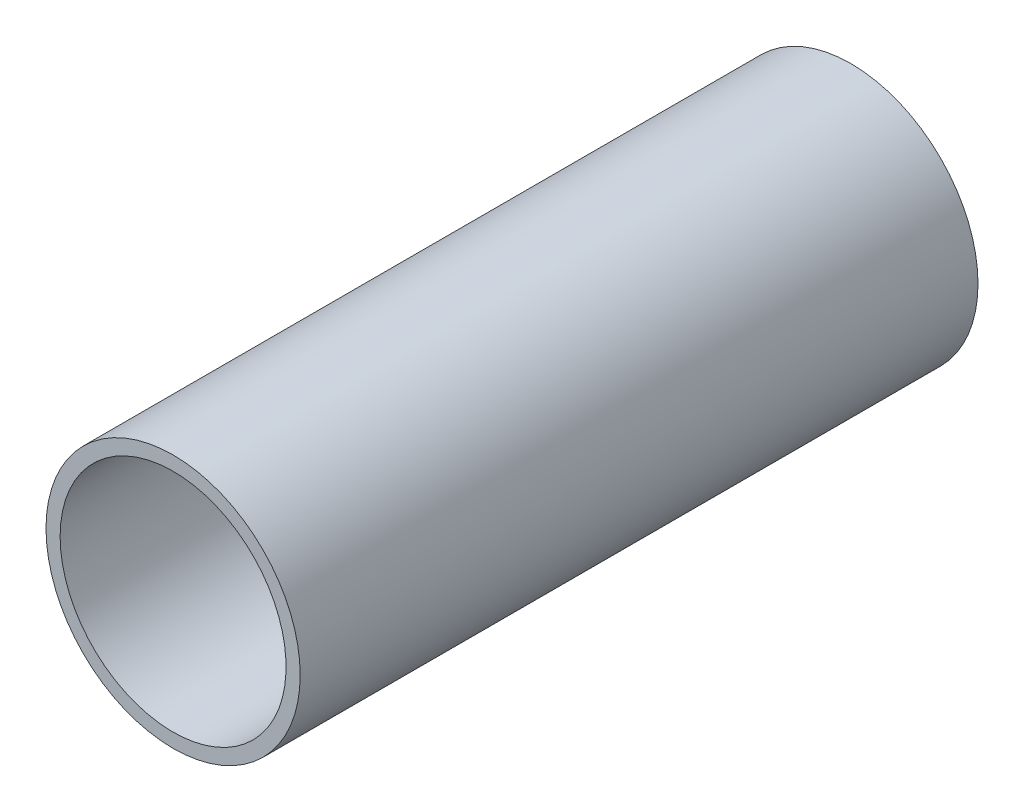
ISO-10303-21;
HEADER;
FILE_DESCRIPTION(('STEP AP214'),'2;1');
FILE_NAME('part.step','',(''),(''),'','','');
FILE_SCHEMA(('AUTOMOTIVE_DESIGN { 1 0 10303 214 1 1 1 1 }'));
ENDSEC;
DATA;
#1=APPLICATION_CONTEXT('core data for automotive mechanical design processes');
#2=APPLICATION_PROTOCOL_DEFINITION('international standard','automotive_design',2000,#1);
#3=PRODUCT_CONTEXT('',#1,'mechanical');
#4=PRODUCT('Part','Part','',(#3));
#5=PRODUCT_RELATED_PRODUCT_CATEGORY('part','',(#4));
#6=PRODUCT_DEFINITION_FORMATION('','',#4);
#7=PRODUCT_DEFINITION_CONTEXT('part definition',#1,'design');
#8=PRODUCT_DEFINITION('design','',#6,#7);
#9=PRODUCT_DEFINITION_SHAPE('','',#8);
#10=(LENGTH_UNIT() NAMED_UNIT(*) SI_UNIT(.MILLI.,.METRE.));
#11=(NAMED_UNIT(*) PLANE_ANGLE_UNIT() SI_UNIT($,.RADIAN.));
#12=(NAMED_UNIT(*) SI_UNIT($,.STERADIAN.) SOLID_ANGLE_UNIT());
#13=UNCERTAINTY_MEASURE_WITH_UNIT(LENGTH_MEASURE(1.E-05),#10,'distance_accuracy_value','');
#14=(GEOMETRIC_REPRESENTATION_CONTEXT(3) GLOBAL_UNCERTAINTY_ASSIGNED_CONTEXT((#13)) GLOBAL_UNIT_ASSIGNED_CONTEXT((#10,
#11,#12)) REPRESENTATION_CONTEXT('',''));
#15=CARTESIAN_POINT('',(0.,0.,0.));
#16=DIRECTION('',(0.,0.,1.));
#17=DIRECTION('',(1.,0.,0.));
#18=AXIS2_PLACEMENT_3D('',#15,#16,#17);
#19=CARTESIAN_POINT('',(0.,0.,304.8));
#20=DIRECTION('',(0.,0.,1.));
#21=DIRECTION('',(1.,0.,0.));
#22=AXIS2_PLACEMENT_3D('',#19,#20,#21);
#23=PLANE('',#22);
#24=CARTESIAN_POINT('',(0.,0.,304.8));
#25=DIRECTION('',(0.,0.,1.));
#26=DIRECTION('',(1.,0.,0.));
#27=AXIS2_PLACEMENT_3D('',#24,#25,#26);
#28=CIRCLE('',#27,57.15);
#29=CARTESIAN_POINT('',(-57.15,0.,304.8));
#30=VERTEX_POINT('',#29);
#31=EDGE_CURVE('E10',#30,#30,#28,.T.);
#32=ORIENTED_EDGE('',*,*,#31,.T.);
#33=EDGE_LOOP('',(#32));
#34=FACE_BOUND('',#33,.T.);
#35=CARTESIAN_POINT('',(0.,0.,304.8));
#36=DIRECTION('',(0.,0.,1.));
#37=DIRECTION('',(1.,0.,0.));
#38=AXIS2_PLACEMENT_3D('',#35,#36,#37);
#39=CIRCLE('',#38,50.8);
#40=CARTESIAN_POINT('',(-50.8,0.,304.8));
#41=VERTEX_POINT('',#40);
#42=EDGE_CURVE('E56',#41,#41,#39,.T.);
#43=ORIENTED_EDGE('',*,*,#42,.F.);
#44=EDGE_LOOP('',(#43));
#45=FACE_BOUND('',#44,.T.);
#46=ADVANCED_FACE('F43',(#34,#45),#23,.T.);
#47=CARTESIAN_POINT('',(0.,0.,0.));
#48=DIRECTION('',(0.,0.,1.));
#49=DIRECTION('',(1.,0.,0.));
#50=AXIS2_PLACEMENT_3D('',#47,#48,#49);
#51=PLANE('',#50);
#52=CARTESIAN_POINT('',(0.,0.,0.));
#53=DIRECTION('',(0.,0.,1.));
#54=DIRECTION('',(1.,0.,0.));
#55=AXIS2_PLACEMENT_3D('',#52,#53,#54);
#56=CIRCLE('',#55,57.15);
#57=CARTESIAN_POINT('',(-57.15,0.,0.));
#58=VERTEX_POINT('',#57);
#59=EDGE_CURVE('E47',#58,#58,#56,.T.);
#60=ORIENTED_EDGE('',*,*,#59,.F.);
#61=EDGE_LOOP('',(#60));
#62=FACE_BOUND('',#61,.T.);
#63=CARTESIAN_POINT('',(0.,0.,0.));
#64=DIRECTION('',(0.,0.,1.));
#65=DIRECTION('',(1.,0.,0.));
#66=AXIS2_PLACEMENT_3D('',#63,#64,#65);
#67=CIRCLE('',#66,50.8);
#68=CARTESIAN_POINT('',(-50.8,0.,0.));
#69=VERTEX_POINT('',#68);
#70=EDGE_CURVE('E58',#69,#69,#67,.T.);
#71=ORIENTED_EDGE('',*,*,#70,.T.);
#72=EDGE_LOOP('',(#71));
#73=FACE_BOUND('',#72,.T.);
#74=ADVANCED_FACE('F70',(#62,#73),#51,.F.);
#75=CARTESIAN_POINT('',(0.,0.,304.8));
#76=DIRECTION('',(0.,0.,-1.));
#77=DIRECTION('',(-1.,0.,0.));
#78=AXIS2_PLACEMENT_3D('',#75,#76,#77);
#79=CYLINDRICAL_SURFACE('',#78,57.15);
#80=CARTESIAN_POINT('',(-57.15,0.,304.8));
#81=CARTESIAN_POINT('',(-57.15,0.,301.625));
#82=CARTESIAN_POINT('',(-57.15,0.,298.45));
#83=CARTESIAN_POINT('',(-57.15,0.,292.1));
#84=CARTESIAN_POINT('',(-57.15,0.,288.925));
#85=CARTESIAN_POINT('',(-57.15,0.,282.575));
#86=CARTESIAN_POINT('',(-57.15,0.,279.4));
#87=CARTESIAN_POINT('',(-57.15,0.,273.05));
#88=CARTESIAN_POINT('',(-57.15,0.,269.875));
#89=CARTESIAN_POINT('',(-57.15,0.,263.525));
#90=CARTESIAN_POINT('',(-57.15,0.,260.35));
#91=CARTESIAN_POINT('',(-57.15,0.,254.));
#92=CARTESIAN_POINT('',(-57.15,0.,250.825));
#93=CARTESIAN_POINT('',(-57.15,0.,244.475));
#94=CARTESIAN_POINT('',(-57.15,0.,241.3));
#95=CARTESIAN_POINT('',(-57.15,0.,234.95));
#96=CARTESIAN_POINT('',(-57.15,0.,231.775));
#97=CARTESIAN_POINT('',(-57.15,0.,225.425));
#98=CARTESIAN_POINT('',(-57.15,0.,222.25));
#99=CARTESIAN_POINT('',(-57.15,0.,215.9));
#100=CARTESIAN_POINT('',(-57.15,0.,212.725));
#101=CARTESIAN_POINT('',(-57.15,0.,206.375));
#102=CARTESIAN_POINT('',(-57.15,0.,203.2));
#103=CARTESIAN_POINT('',(-57.15,0.,196.85));
#104=CARTESIAN_POINT('',(-57.15,0.,193.675));
#105=CARTESIAN_POINT('',(-57.15,0.,187.325));
#106=CARTESIAN_POINT('',(-57.15,0.,184.15));
#107=CARTESIAN_POINT('',(-57.15,0.,177.8));
#108=CARTESIAN_POINT('',(-57.15,0.,174.625));
#109=CARTESIAN_POINT('',(-57.15,0.,168.275));
#110=CARTESIAN_POINT('',(-57.15,0.,165.1));
#111=CARTESIAN_POINT('',(-57.15,0.,158.75));
#112=CARTESIAN_POINT('',(-57.15,0.,155.575));
#113=CARTESIAN_POINT('',(-57.15,0.,149.225));
#114=CARTESIAN_POINT('',(-57.15,0.,146.05));
#115=CARTESIAN_POINT('',(-57.15,0.,139.7));
#116=CARTESIAN_POINT('',(-57.15,0.,136.525));
#117=CARTESIAN_POINT('',(-57.15,0.,130.175));
#118=CARTESIAN_POINT('',(-57.15,0.,127.));
#119=CARTESIAN_POINT('',(-57.15,0.,120.65));
#120=CARTESIAN_POINT('',(-57.15,0.,117.475));
#121=CARTESIAN_POINT('',(-57.15,0.,111.125));
#122=CARTESIAN_POINT('',(-57.15,0.,107.95));
#123=CARTESIAN_POINT('',(-57.15,0.,101.6));
#124=CARTESIAN_POINT('',(-57.15,0.,98.425));
#125=CARTESIAN_POINT('',(-57.15,0.,92.075));
#126=CARTESIAN_POINT('',(-57.15,0.,88.9));
#127=CARTESIAN_POINT('',(-57.15,0.,82.55));
#128=CARTESIAN_POINT('',(-57.15,0.,79.375));
#129=CARTESIAN_POINT('',(-57.15,0.,73.025));
#130=CARTESIAN_POINT('',(-57.15,0.,69.85));
#131=CARTESIAN_POINT('',(-57.15,0.,63.5));
#132=CARTESIAN_POINT('',(-57.15,0.,60.325));
#133=CARTESIAN_POINT('',(-57.15,0.,53.975));
#134=CARTESIAN_POINT('',(-57.15,0.,50.8));
#135=CARTESIAN_POINT('',(-57.15,0.,44.45));
#136=CARTESIAN_POINT('',(-57.15,0.,41.275));
#137=CARTESIAN_POINT('',(-57.15,0.,34.925));
#138=CARTESIAN_POINT('',(-57.15,0.,31.75));
#139=CARTESIAN_POINT('',(-57.15,0.,25.4));
#140=CARTESIAN_POINT('',(-57.15,0.,22.225));
#141=CARTESIAN_POINT('',(-57.15,0.,15.875));
#142=CARTESIAN_POINT('',(-57.15,0.,12.7));
#143=CARTESIAN_POINT('',(-57.15,0.,6.35));
#144=CARTESIAN_POINT('',(-57.15,0.,3.175));
#145=CARTESIAN_POINT('',(-57.15,0.,0.));
#146=B_SPLINE_CURVE_WITH_KNOTS('',3,(#80,#81,#82,#83,#84,#85,#86,#87,#88,#89,#90,#91,#92,#93,
#94,#95,#96,#97,#98,#99,#100,#101,#102,#103,#104,#105,#106,#107,#108,#109,#110,#111,#112,#113,
#114,#115,#116,#117,#118,#119,#120,#121,#122,#123,#124,#125,#126,#127,#128,#129,#130,#131,#132,
#133,#134,#135,#136,#137,#138,#139,#140,#141,#142,#143,#144,#145),.UNSPECIFIED.,.F.,.F.,(4,2,2,
2,2,2,2,2,2,2,2,2,2,2,2,2,2,2,2,2,2,2,2,2,2,2,2,2,2,2,2,2,4),(0.,9.52500000000001,19.05,28.575,
38.1,47.625,57.15,66.675,76.2,85.7250000000001,95.2500000000001,104.775,114.3,123.825,133.35,
142.875,152.4,161.925,171.45,180.975,190.5,200.025,209.55,219.075,228.6,238.125,247.65,257.175,
266.7,276.225,285.75,295.275,304.8),.UNSPECIFIED.);
#147=EDGE_CURVE('BSEAM45',#30,#58,#146,.T.);
#148=ORIENTED_EDGE('',*,*,#31,.F.);
#149=ORIENTED_EDGE('',*,*,#59,.T.);
#150=ORIENTED_EDGE('',*,*,#147,.T.);
#151=ORIENTED_EDGE('',*,*,#147,.F.);
#152=EDGE_LOOP('',(#148,#150,#149,#151));
#153=FACE_BOUND('',#152,.T.);
#154=ADVANCED_FACE('F45',(#153),#79,.T.);
#155=CARTESIAN_POINT('',(0.,0.,304.8));
#156=DIRECTION('',(0.,0.,-1.));
#157=DIRECTION('',(-1.,0.,0.));
#158=AXIS2_PLACEMENT_3D('',#155,#156,#157);
#159=CYLINDRICAL_SURFACE('',#158,50.8);
#160=CARTESIAN_POINT('',(-50.8,0.,304.8));
#161=CARTESIAN_POINT('',(-50.8,0.,301.625));
#162=CARTESIAN_POINT('',(-50.8,0.,298.45));
#163=CARTESIAN_POINT('',(-50.8,0.,292.1));
#164=CARTESIAN_POINT('',(-50.8,0.,288.925));
#165=CARTESIAN_POINT('',(-50.8,0.,282.575));
#166=CARTESIAN_POINT('',(-50.8,0.,279.4));
#167=CARTESIAN_POINT('',(-50.8,0.,273.05));
#168=CARTESIAN_POINT('',(-50.8,0.,269.875));
#169=CARTESIAN_POINT('',(-50.8,0.,263.525));
#170=CARTESIAN_POINT('',(-50.8,0.,260.35));
#171=CARTESIAN_POINT('',(-50.8,0.,254.));
#172=CARTESIAN_POINT('',(-50.8,0.,250.825));
#173=CARTESIAN_POINT('',(-50.8,0.,244.475));
#174=CARTESIAN_POINT('',(-50.8,0.,241.3));
#175=CARTESIAN_POINT('',(-50.8,0.,234.95));
#176=CARTESIAN_POINT('',(-50.8,0.,231.775));
#177=CARTESIAN_POINT('',(-50.8,0.,225.425));
#178=CARTESIAN_POINT('',(-50.8,0.,222.25));
#179=CARTESIAN_POINT('',(-50.8,0.,215.9));
#180=CARTESIAN_POINT('',(-50.8,0.,212.725));
#181=CARTESIAN_POINT('',(-50.8,0.,206.375));
#182=CARTESIAN_POINT('',(-50.8,0.,203.2));
#183=CARTESIAN_POINT('',(-50.8,0.,196.85));
#184=CARTESIAN_POINT('',(-50.8,0.,193.675));
#185=CARTESIAN_POINT('',(-50.8,0.,187.325));
#186=CARTESIAN_POINT('',(-50.8,0.,184.15));
#187=CARTESIAN_POINT('',(-50.8,0.,177.8));
#188=CARTESIAN_POINT('',(-50.8,0.,174.625));
#189=CARTESIAN_POINT('',(-50.8,0.,168.275));
#190=CARTESIAN_POINT('',(-50.8,0.,165.1));
#191=CARTESIAN_POINT('',(-50.8,0.,158.75));
#192=CARTESIAN_POINT('',(-50.8,0.,155.575));
#193=CARTESIAN_POINT('',(-50.8,0.,149.225));
#194=CARTESIAN_POINT('',(-50.8,0.,146.05));
#195=CARTESIAN_POINT('',(-50.8,0.,139.7));
#196=CARTESIAN_POINT('',(-50.8,0.,136.525));
#197=CARTESIAN_POINT('',(-50.8,0.,130.175));
#198=CARTESIAN_POINT('',(-50.8,0.,127.));
#199=CARTESIAN_POINT('',(-50.8,0.,120.65));
#200=CARTESIAN_POINT('',(-50.8,0.,117.475));
#201=CARTESIAN_POINT('',(-50.8,0.,111.125));
#202=CARTESIAN_POINT('',(-50.8,0.,107.95));
#203=CARTESIAN_POINT('',(-50.8,0.,101.6));
#204=CARTESIAN_POINT('',(-50.8,0.,98.425));
#205=CARTESIAN_POINT('',(-50.8,0.,92.075));
#206=CARTESIAN_POINT('',(-50.8,0.,88.9));
#207=CARTESIAN_POINT('',(-50.8,0.,82.55));
#208=CARTESIAN_POINT('',(-50.8,0.,79.375));
#209=CARTESIAN_POINT('',(-50.8,0.,73.025));
#210=CARTESIAN_POINT('',(-50.8,0.,69.85));
#211=CARTESIAN_POINT('',(-50.8,0.,63.5));
#212=CARTESIAN_POINT('',(-50.8,0.,60.325));
#213=CARTESIAN_POINT('',(-50.8,0.,53.975));
#214=CARTESIAN_POINT('',(-50.8,0.,50.8));
#215=CARTESIAN_POINT('',(-50.8,0.,44.45));
#216=CARTESIAN_POINT('',(-50.8,0.,41.275));
#217=CARTESIAN_POINT('',(-50.8,0.,34.925));
#218=CARTESIAN_POINT('',(-50.8,0.,31.75));
#219=CARTESIAN_POINT('',(-50.8,0.,25.4));
#220=CARTESIAN_POINT('',(-50.8,0.,22.225));
#221=CARTESIAN_POINT('',(-50.8,0.,15.875));
#222=CARTESIAN_POINT('',(-50.8,0.,12.7));
#223=CARTESIAN_POINT('',(-50.8,0.,6.35));
#224=CARTESIAN_POINT('',(-50.8,0.,3.175));
#225=CARTESIAN_POINT('',(-50.8,0.,0.));
#226=B_SPLINE_CURVE_WITH_KNOTS('',3,(#160,#161,#162,#163,#164,#165,#166,#167,#168,#169,#170,
#171,#172,#173,#174,#175,#176,#177,#178,#179,#180,#181,#182,#183,#184,#185,#186,#187,#188,#189,
#190,#191,#192,#193,#194,#195,#196,#197,#198,#199,#200,#201,#202,#203,#204,#205,#206,#207,#208,
#209,#210,#211,#212,#213,#214,#215,#216,#217,#218,#219,#220,#221,#222,#223,#224,#225),
.UNSPECIFIED.,.F.,.F.,(4,2,2,2,2,2,2,2,2,2,2,2,2,2,2,2,2,2,2,2,2,2,2,2,2,2,2,2,2,2,2,2,4),(0.,
9.52499999999995,19.05,28.575,38.1,47.625,57.15,66.675,76.2,85.725,95.2499999999999,104.775,
114.3,123.825,133.35,142.875,152.4,161.925,171.45,180.975,190.5,200.025,209.55,219.075,228.6,
238.125,247.65,257.175,266.7,276.225,285.75,295.275,304.8),.UNSPECIFIED.);
#227=EDGE_CURVE('BSEAM66',#41,#69,#226,.T.);
#228=ORIENTED_EDGE('',*,*,#42,.T.);
#229=ORIENTED_EDGE('',*,*,#70,.F.);
#230=ORIENTED_EDGE('',*,*,#227,.T.);
#231=ORIENTED_EDGE('',*,*,#227,.F.);
#232=EDGE_LOOP('',(#228,#230,#229,#231));
#233=FACE_BOUND('',#232,.T.);
#234=ADVANCED_FACE('F66',(#233),#159,.F.);
#235=CLOSED_SHELL('',(#46,#74,#154,#234));
#236=MANIFOLD_SOLID_BREP('B2',#235);
#237=ADVANCED_BREP_SHAPE_REPRESENTATION('',(#18,#236),#14);
#238=SHAPE_DEFINITION_REPRESENTATION(#9,#237);
ENDSEC;
END-ISO-10303-21;
